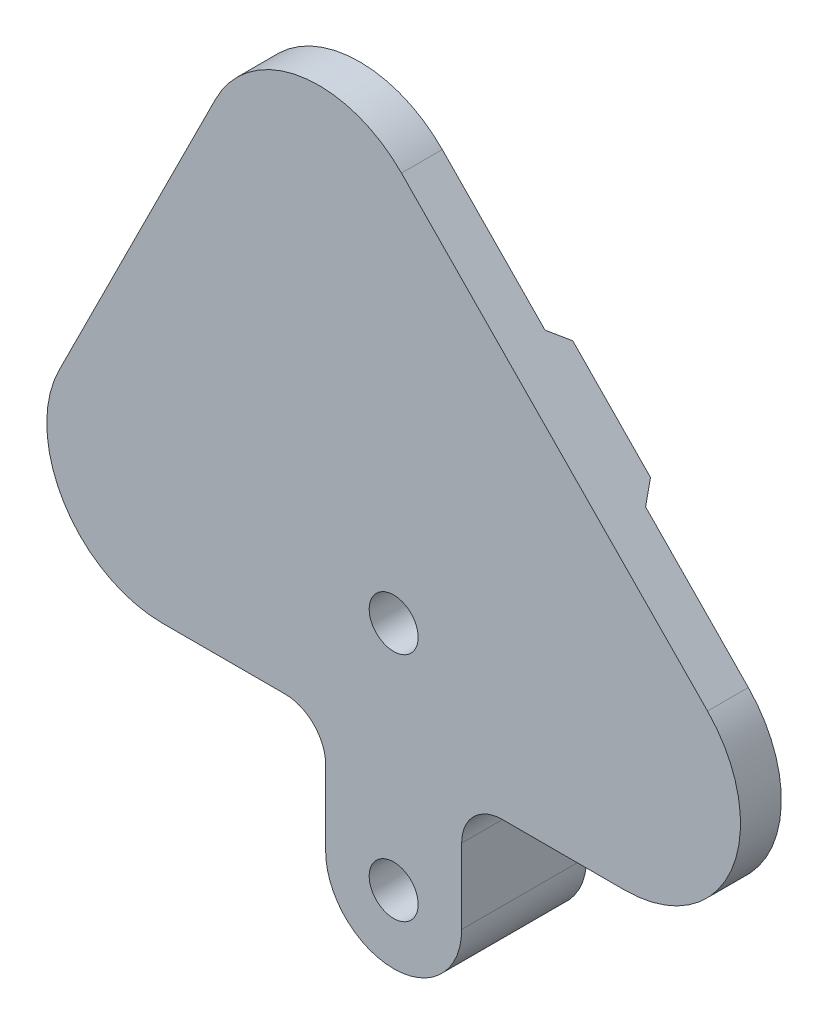
ISO-10303-21;
HEADER;
FILE_DESCRIPTION(('STEP AP214'),'2;1');
FILE_NAME('part.step','',(''),(''),'','','');
FILE_SCHEMA(('AUTOMOTIVE_DESIGN { 1 0 10303 214 1 1 1 1 }'));
ENDSEC;
DATA;
#1=APPLICATION_CONTEXT('core data for automotive mechanical design processes');
#2=APPLICATION_PROTOCOL_DEFINITION('international standard','automotive_design',2000,#1);
#3=PRODUCT_CONTEXT('',#1,'mechanical');
#4=PRODUCT('Part','Part','',(#3));
#5=PRODUCT_RELATED_PRODUCT_CATEGORY('part','',(#4));
#6=PRODUCT_DEFINITION_FORMATION('','',#4);
#7=PRODUCT_DEFINITION_CONTEXT('part definition',#1,'design');
#8=PRODUCT_DEFINITION('design','',#6,#7);
#9=PRODUCT_DEFINITION_SHAPE('','',#8);
#10=(LENGTH_UNIT() NAMED_UNIT(*) SI_UNIT(.MILLI.,.METRE.));
#11=(NAMED_UNIT(*) PLANE_ANGLE_UNIT() SI_UNIT($,.RADIAN.));
#12=(NAMED_UNIT(*) SI_UNIT($,.STERADIAN.) SOLID_ANGLE_UNIT());
#13=UNCERTAINTY_MEASURE_WITH_UNIT(LENGTH_MEASURE(1.E-05),#10,'distance_accuracy_value','');
#14=(GEOMETRIC_REPRESENTATION_CONTEXT(3) GLOBAL_UNCERTAINTY_ASSIGNED_CONTEXT((#13)) GLOBAL_UNIT_ASSIGNED_CONTEXT((#10,
#11,#12)) REPRESENTATION_CONTEXT('',''));
#15=CARTESIAN_POINT('',(0.,0.,0.));
#16=DIRECTION('',(0.,0.,1.));
#17=DIRECTION('',(1.,0.,0.));
#18=AXIS2_PLACEMENT_3D('',#15,#16,#17);
#19=CARTESIAN_POINT('',(9.00000000000001,-11.5,0.));
#20=DIRECTION('',(0.,0.,1.));
#21=DIRECTION('',(1.,0.,0.));
#22=AXIS2_PLACEMENT_3D('',#19,#20,#21);
#23=PLANE('',#22);
#24=CARTESIAN_POINT('',(34.,0.,0.));
#25=DIRECTION('',(0.,0.,-1.));
#26=DIRECTION('',(-1.,0.,0.));
#27=AXIS2_PLACEMENT_3D('',#24,#25,#26);
#28=CIRCLE('',#27,6.);
#29=CARTESIAN_POINT('',(28.,0.,0.));
#30=VERTEX_POINT('',#29);
#31=EDGE_CURVE('E281',#30,#30,#28,.T.);
#32=ORIENTED_EDGE('',*,*,#31,.F.);
#33=EDGE_LOOP('',(#32));
#34=FACE_BOUND('',#33,.T.);
#35=CARTESIAN_POINT('',(25.,3.78598738163178,0.));
#36=DIRECTION('',(0.,0.,1.));
#37=DIRECTION('',(1.,0.,0.));
#38=AXIS2_PLACEMENT_3D('',#35,#36,#37);
#39=CIRCLE('',#38,1.80000000000002);
#40=CARTESIAN_POINT('',(23.2,3.78598738163178,0.));
#41=VERTEX_POINT('',#40);
#42=CARTESIAN_POINT('',(23.7412705201653,5.07268862768507,0.));
#43=VERTEX_POINT('',#42);
#44=EDGE_CURVE('E401',#41,#43,#39,.F.);
#45=ORIENTED_EDGE('',*,*,#44,.T.);
#46=DIRECTION('',(0.714834025585147,0.699294155463731,0.));
#47=VECTOR('',#46,1.);
#48=CARTESIAN_POINT('',(32.5237123384654,13.6642077977613,0.));
#49=LINE('',#48,#47);
#50=CARTESIAN_POINT('',(32.5237123384654,13.6642077977613,0.));
#51=VERTEX_POINT('',#50);
#52=EDGE_CURVE('E403',#43,#51,#49,.T.);
#53=ORIENTED_EDGE('',*,*,#52,.T.);
#54=DIRECTION('',(-0.699294155463731,0.714834025585147,0.));
#55=VECTOR('',#54,1.);
#56=CARTESIAN_POINT('',(17.5760892174738,28.9440003214417,0.));
#57=LINE('',#56,#55);
#58=CARTESIAN_POINT('',(40.0760892174738,5.94400032144171,0.));
#59=VERTEX_POINT('',#58);
#60=EDGE_CURVE('E331',#59,#51,#57,.T.);
#61=ORIENTED_EDGE('',*,*,#60,.F.);
#62=CARTESIAN_POINT('',(34.,0.,0.));
#63=DIRECTION('',(0.,0.,1.));
#64=DIRECTION('',(1.,0.,0.));
#65=AXIS2_PLACEMENT_3D('',#62,#63,#64);
#66=CIRCLE('',#65,8.5);
#67=CARTESIAN_POINT('',(34.,-8.5,0.));
#68=VERTEX_POINT('',#67);
#69=EDGE_CURVE('E328',#68,#59,#66,.T.);
#70=ORIENTED_EDGE('',*,*,#69,.F.);
#71=DIRECTION('',(1.,0.,0.));
#72=VECTOR('',#71,1.);
#73=CARTESIAN_POINT('',(34.,-8.5,0.));
#74=LINE('',#73,#72);
#75=CARTESIAN_POINT('',(25.,-8.5,0.));
#76=VERTEX_POINT('',#75);
#77=EDGE_CURVE('E326',#76,#68,#74,.T.);
#78=ORIENTED_EDGE('',*,*,#77,.F.);
#79=CARTESIAN_POINT('',(25.,-11.5,0.));
#80=DIRECTION('',(0.,0.,-1.));
#81=DIRECTION('',(-1.,0.,0.));
#82=AXIS2_PLACEMENT_3D('',#79,#80,#81);
#83=CIRCLE('',#82,3.);
#84=CARTESIAN_POINT('',(23.2,-9.10000000000001,0.));
#85=VERTEX_POINT('',#84);
#86=EDGE_CURVE('E324',#85,#76,#83,.T.);
#87=ORIENTED_EDGE('',*,*,#86,.F.);
#88=DIRECTION('',(0.,1.,0.));
#89=VECTOR('',#88,1.);
#90=CARTESIAN_POINT('',(23.2,3.78598738163177,0.));
#91=LINE('',#90,#89);
#92=EDGE_CURVE('E399',#85,#41,#91,.T.);
#93=ORIENTED_EDGE('',*,*,#92,.T.);
#94=EDGE_LOOP('',(#45,#53,#61,#70,#78,#87,#93));
#95=FACE_BOUND('',#94,.T.);
#96=ADVANCED_FACE('F37',(#34,#95),#23,.F.);
#97=CARTESIAN_POINT('',(11.5,23.,0.));
#98=DIRECTION('',(0.,0.,-1.));
#99=DIRECTION('',(-1.,0.,0.));
#100=AXIS2_PLACEMENT_3D('',#97,#98,#99);
#101=CIRCLE('',#100,6.);
#102=CARTESIAN_POINT('',(5.5,23.,0.));
#103=VERTEX_POINT('',#102);
#104=EDGE_CURVE('E285',#103,#103,#101,.T.);
#105=ORIENTED_EDGE('',*,*,#104,.F.);
#106=EDGE_LOOP('',(#105));
#107=FACE_BOUND('',#106,.T.);
#108=CARTESIAN_POINT('',(13.9664545837515,12.8225007981251,0.));
#109=DIRECTION('',(0.,0.,1.));
#110=DIRECTION('',(1.,0.,0.));
#111=AXIS2_PLACEMENT_3D('',#108,#109,#110);
#112=CIRCLE('',#111,1.8);
#113=CARTESIAN_POINT('',(15.2251840635862,11.5357995520718,0.));
#114=VERTEX_POINT('',#113);
#115=CARTESIAN_POINT('',(13.1614701118516,11.2125318543253,0.));
#116=VERTEX_POINT('',#115);
#117=EDGE_CURVE('E389',#114,#116,#112,.F.);
#118=ORIENTED_EDGE('',*,*,#117,.T.);
#119=DIRECTION('',(-0.894427190999916,0.447213595499958,0.));
#120=VECTOR('',#119,1.);
#121=CARTESIAN_POINT('',(-0.485324359398882,18.0359290899505,0.));
#122=LINE('',#121,#120);
#123=CARTESIAN_POINT('',(-0.485324359398881,18.0359290899505,0.));
#124=VERTEX_POINT('',#123);
#125=EDGE_CURVE('E391',#116,#124,#122,.T.);
#126=ORIENTED_EDGE('',*,*,#125,.T.);
#127=DIRECTION('',(-0.447213595499958,-0.894427190999916,0.));
#128=VECTOR('',#127,1.);
#129=CARTESIAN_POINT('',(-7.60263112349929,3.80131556174964,0.));
#130=LINE('',#129,#128);
#131=CARTESIAN_POINT('',(3.89736887650071,26.8013155617496,0.));
#132=VERTEX_POINT('',#131);
#133=EDGE_CURVE('E337',#132,#124,#130,.T.);
#134=ORIENTED_EDGE('',*,*,#133,.F.);
#135=CARTESIAN_POINT('',(11.5,23.,0.));
#136=DIRECTION('',(0.,0.,1.));
#137=DIRECTION('',(1.,0.,0.));
#138=AXIS2_PLACEMENT_3D('',#135,#136,#137);
#139=CIRCLE('',#138,8.5);
#140=CARTESIAN_POINT('',(17.5760892174738,28.9440003214417,0.));
#141=VERTEX_POINT('',#140);
#142=EDGE_CURVE('E334',#141,#132,#139,.T.);
#143=ORIENTED_EDGE('',*,*,#142,.F.);
#144=CARTESIAN_POINT('',(25.128466096482,21.2237928451221,0.));
#145=VERTEX_POINT('',#144);
#146=EDGE_CURVE('E330',#145,#141,#57,.T.);
#147=ORIENTED_EDGE('',*,*,#146,.F.);
#148=DIRECTION('',(-0.714834025585147,-0.699294155463731,0.));
#149=VECTOR('',#148,1.);
#150=CARTESIAN_POINT('',(15.2251840635862,11.5357995520718,0.));
#151=LINE('',#150,#149);
#152=EDGE_CURVE('E387',#145,#114,#151,.T.);
#153=ORIENTED_EDGE('',*,*,#152,.T.);
#154=EDGE_LOOP('',(#118,#126,#134,#143,#147,#153));
#155=FACE_BOUND('',#154,.T.);
#156=ADVANCED_FACE('F477',(#107,#155),#23,.F.);
#157=CARTESIAN_POINT('',(0.,0.,0.));
#158=DIRECTION('',(0.,0.,-1.));
#159=DIRECTION('',(-1.,0.,0.));
#160=AXIS2_PLACEMENT_3D('',#157,#158,#159);
#161=CIRCLE('',#160,6.);
#162=CARTESIAN_POINT('',(-6.,0.,0.));
#163=VERTEX_POINT('',#162);
#164=EDGE_CURVE('E280',#163,#163,#161,.T.);
#165=ORIENTED_EDGE('',*,*,#164,.F.);
#166=EDGE_LOOP('',(#165));
#167=FACE_BOUND('',#166,.T.);
#168=CARTESIAN_POINT('',(-3.2199378875997,12.5667020335488,0.));
#169=VERTEX_POINT('',#168);
#170=CARTESIAN_POINT('',(-7.60263112349929,3.80131556174964,0.));
#171=VERTEX_POINT('',#170);
#172=EDGE_CURVE('E336',#169,#171,#130,.T.);
#173=ORIENTED_EDGE('',*,*,#172,.F.);
#174=DIRECTION('',(0.894427190999916,-0.447213595499958,0.));
#175=VECTOR('',#174,1.);
#176=CARTESIAN_POINT('',(9.80498447189993,6.05424085379901,0.));
#177=LINE('',#176,#175);
#178=CARTESIAN_POINT('',(9.80498447189993,6.05424085379901,0.));
#179=VERTEX_POINT('',#178);
#180=EDGE_CURVE('E397',#169,#179,#177,.T.);
#181=ORIENTED_EDGE('',*,*,#180,.T.);
#182=CARTESIAN_POINT('',(9.,4.44427190999916,0.));
#183=DIRECTION('',(0.,0.,1.));
#184=DIRECTION('',(1.,0.,0.));
#185=AXIS2_PLACEMENT_3D('',#182,#183,#184);
#186=CIRCLE('',#185,1.80000000000001);
#187=CARTESIAN_POINT('',(10.8,4.44427190999916,0.));
#188=VERTEX_POINT('',#187);
#189=EDGE_CURVE('E395',#179,#188,#186,.F.);
#190=ORIENTED_EDGE('',*,*,#189,.T.);
#191=DIRECTION('',(0.,-1.,0.));
#192=VECTOR('',#191,1.);
#193=CARTESIAN_POINT('',(10.8,-11.5,0.));
#194=LINE('',#193,#192);
#195=CARTESIAN_POINT('',(10.8,-9.10000000000001,0.));
#196=VERTEX_POINT('',#195);
#197=EDGE_CURVE('E393',#188,#196,#194,.T.);
#198=ORIENTED_EDGE('',*,*,#197,.T.);
#199=CARTESIAN_POINT('',(9.00000000000001,-11.5,0.));
#200=DIRECTION('',(0.,0.,-1.));
#201=DIRECTION('',(1.,0.,0.));
#202=AXIS2_PLACEMENT_3D('',#199,#200,#201);
#203=CIRCLE('',#202,3.);
#204=CARTESIAN_POINT('',(8.99999999999998,-8.5,0.));
#205=VERTEX_POINT('',#204);
#206=EDGE_CURVE('E295',#205,#196,#203,.T.);
#207=ORIENTED_EDGE('',*,*,#206,.F.);
#208=DIRECTION('',(1.,0.,0.));
#209=VECTOR('',#208,1.);
#210=CARTESIAN_POINT('',(8.99999999999998,-8.5,0.));
#211=LINE('',#210,#209);
#212=CARTESIAN_POINT('',(0.,-8.5,0.));
#213=VERTEX_POINT('',#212);
#214=EDGE_CURVE('E300',#213,#205,#211,.T.);
#215=ORIENTED_EDGE('',*,*,#214,.F.);
#216=CARTESIAN_POINT('',(0.,0.,0.));
#217=DIRECTION('',(0.,0.,1.));
#218=DIRECTION('',(1.,0.,0.));
#219=AXIS2_PLACEMENT_3D('',#216,#217,#218);
#220=CIRCLE('',#219,8.5);
#221=EDGE_CURVE('E340',#171,#213,#220,.T.);
#222=ORIENTED_EDGE('',*,*,#221,.F.);
#223=EDGE_LOOP('',(#173,#181,#190,#198,#207,#215,#222));
#224=FACE_BOUND('',#223,.T.);
#225=ADVANCED_FACE('F480',(#167,#224),#23,.F.);
#226=CARTESIAN_POINT('',(9.00000000000001,-11.5,3.));
#227=DIRECTION('',(0.,0.,1.));
#228=DIRECTION('',(1.,0.,0.));
#229=AXIS2_PLACEMENT_3D('',#226,#227,#228);
#230=PLANE('',#229);
#231=CARTESIAN_POINT('',(17.,0.,3.));
#232=DIRECTION('',(0.,0.,1.));
#233=DIRECTION('',(1.,0.,0.));
#234=AXIS2_PLACEMENT_3D('',#231,#232,#233);
#235=CIRCLE('',#234,1.8);
#236=CARTESIAN_POINT('',(18.8,0.,3.));
#237=VERTEX_POINT('',#236);
#238=EDGE_CURVE('E292',#237,#237,#235,.T.);
#239=ORIENTED_EDGE('',*,*,#238,.F.);
#240=EDGE_LOOP('',(#239));
#241=FACE_BOUND('',#240,.T.);
#242=CARTESIAN_POINT('',(9.00000000000001,-11.5,3.));
#243=DIRECTION('',(0.,0.,-1.));
#244=DIRECTION('',(1.,0.,0.));
#245=AXIS2_PLACEMENT_3D('',#242,#243,#244);
#246=CIRCLE('',#245,3.);
#247=CARTESIAN_POINT('',(8.99999999999998,-8.5,3.));
#248=VERTEX_POINT('',#247);
#249=CARTESIAN_POINT('',(12.,-11.5,3.));
#250=VERTEX_POINT('',#249);
#251=EDGE_CURVE('E296',#248,#250,#246,.T.);
#252=ORIENTED_EDGE('',*,*,#251,.T.);
#253=DIRECTION('',(0.,-1.,0.));
#254=VECTOR('',#253,1.);
#255=CARTESIAN_POINT('',(12.,-17.,3.));
#256=LINE('',#255,#254);
#257=CARTESIAN_POINT('',(12.,-17.,3.));
#258=VERTEX_POINT('',#257);
#259=EDGE_CURVE('E299',#250,#258,#256,.T.);
#260=ORIENTED_EDGE('',*,*,#259,.T.);
#261=CARTESIAN_POINT('',(17.,-17.,3.));
#262=DIRECTION('',(0.,0.,1.));
#263=DIRECTION('',(1.,0.,0.));
#264=AXIS2_PLACEMENT_3D('',#261,#262,#263);
#265=CIRCLE('',#264,5.);
#266=CARTESIAN_POINT('',(22.,-17.,3.));
#267=VERTEX_POINT('',#266);
#268=EDGE_CURVE('E214',#258,#267,#265,.T.);
#269=ORIENTED_EDGE('',*,*,#268,.T.);
#270=DIRECTION('',(0.,1.,0.));
#271=VECTOR('',#270,1.);
#272=CARTESIAN_POINT('',(22.,-17.,3.));
#273=LINE('',#272,#271);
#274=CARTESIAN_POINT('',(22.,-11.5,3.));
#275=VERTEX_POINT('',#274);
#276=EDGE_CURVE('E303',#267,#275,#273,.T.);
#277=ORIENTED_EDGE('',*,*,#276,.T.);
#278=CARTESIAN_POINT('',(25.,-11.5,3.));
#279=DIRECTION('',(0.,0.,-1.));
#280=DIRECTION('',(-1.,0.,0.));
#281=AXIS2_PLACEMENT_3D('',#278,#279,#280);
#282=CIRCLE('',#281,3.);
#283=CARTESIAN_POINT('',(25.,-8.5,3.));
#284=VERTEX_POINT('',#283);
#285=EDGE_CURVE('E305',#275,#284,#282,.T.);
#286=ORIENTED_EDGE('',*,*,#285,.T.);
#287=DIRECTION('',(1.,0.,0.));
#288=VECTOR('',#287,1.);
#289=CARTESIAN_POINT('',(34.,-8.5,3.));
#290=LINE('',#289,#288);
#291=CARTESIAN_POINT('',(34.,-8.5,3.));
#292=VERTEX_POINT('',#291);
#293=EDGE_CURVE('E307',#284,#292,#290,.T.);
#294=ORIENTED_EDGE('',*,*,#293,.T.);
#295=CARTESIAN_POINT('',(34.,0.,3.));
#296=DIRECTION('',(0.,0.,1.));
#297=DIRECTION('',(1.,0.,0.));
#298=AXIS2_PLACEMENT_3D('',#295,#296,#297);
#299=CIRCLE('',#298,8.5);
#300=CARTESIAN_POINT('',(40.0760892174738,5.94400032144171,3.));
#301=VERTEX_POINT('',#300);
#302=EDGE_CURVE('E309',#292,#301,#299,.T.);
#303=ORIENTED_EDGE('',*,*,#302,.T.);
#304=DIRECTION('',(-0.699294155463731,0.714834025585147,0.));
#305=VECTOR('',#304,1.);
#306=CARTESIAN_POINT('',(17.5760892174738,28.9440003214417,3.));
#307=LINE('',#306,#305);
#308=CARTESIAN_POINT('',(17.5760892174738,28.9440003214417,3.));
#309=VERTEX_POINT('',#308);
#310=EDGE_CURVE('E311',#301,#309,#307,.T.);
#311=ORIENTED_EDGE('',*,*,#310,.T.);
#312=CARTESIAN_POINT('',(11.5,23.,3.));
#313=DIRECTION('',(0.,0.,1.));
#314=DIRECTION('',(1.,0.,0.));
#315=AXIS2_PLACEMENT_3D('',#312,#313,#314);
#316=CIRCLE('',#315,8.5);
#317=CARTESIAN_POINT('',(3.89736887650071,26.8013155617496,3.));
#318=VERTEX_POINT('',#317);
#319=EDGE_CURVE('E313',#309,#318,#316,.T.);
#320=ORIENTED_EDGE('',*,*,#319,.T.);
#321=DIRECTION('',(-0.447213595499958,-0.894427190999916,0.));
#322=VECTOR('',#321,1.);
#323=CARTESIAN_POINT('',(-7.60263112349929,3.80131556174964,3.));
#324=LINE('',#323,#322);
#325=CARTESIAN_POINT('',(-7.60263112349929,3.80131556174964,3.));
#326=VERTEX_POINT('',#325);
#327=EDGE_CURVE('E315',#318,#326,#324,.T.);
#328=ORIENTED_EDGE('',*,*,#327,.T.);
#329=CARTESIAN_POINT('',(0.,0.,3.));
#330=DIRECTION('',(0.,0.,1.));
#331=DIRECTION('',(1.,0.,0.));
#332=AXIS2_PLACEMENT_3D('',#329,#330,#331);
#333=CIRCLE('',#332,8.5);
#334=CARTESIAN_POINT('',(0.,-8.5,3.));
#335=VERTEX_POINT('',#334);
#336=EDGE_CURVE('E317',#326,#335,#333,.T.);
#337=ORIENTED_EDGE('',*,*,#336,.T.);
#338=DIRECTION('',(1.,0.,0.));
#339=VECTOR('',#338,1.);
#340=CARTESIAN_POINT('',(8.99999999999998,-8.5,3.));
#341=LINE('',#340,#339);
#342=EDGE_CURVE('E319',#335,#248,#341,.T.);
#343=ORIENTED_EDGE('',*,*,#342,.T.);
#344=EDGE_LOOP('',(#252,#260,#269,#277,#286,#294,#303,#311,#320,#328,#337,#343));
#345=FACE_BOUND('',#344,.T.);
#346=CARTESIAN_POINT('',(17.,-17.,3.));
#347=DIRECTION('',(0.,0.,1.));
#348=DIRECTION('',(1.,0.,0.));
#349=AXIS2_PLACEMENT_3D('',#346,#347,#348);
#350=CIRCLE('',#349,1.8);
#351=CARTESIAN_POINT('',(18.8,-17.,3.));
#352=VERTEX_POINT('',#351);
#353=EDGE_CURVE('E284',#352,#352,#350,.T.);
#354=ORIENTED_EDGE('',*,*,#353,.F.);
#355=EDGE_LOOP('',(#354));
#356=FACE_BOUND('',#355,.T.);
#357=ADVANCED_FACE('F461',(#241,#345,#356),#230,.T.);
#358=CARTESIAN_POINT('',(9.00000000000001,-11.5,3.));
#359=DIRECTION('',(0.,0.,-1.));
#360=DIRECTION('',(-1.,0.,0.));
#361=AXIS2_PLACEMENT_3D('',#358,#359,#360);
#362=CYLINDRICAL_SURFACE('',#361,3.);
#363=ORIENTED_EDGE('',*,*,#206,.T.);
#364=CARTESIAN_POINT('',(9.00000000000001,-11.5,1.80000000000003));
#365=DIRECTION('',(-0.707106781186552,0.,-0.707106781186543));
#366=DIRECTION('',(0.707106781186543,0.,-0.707106781186552));
#367=AXIS2_PLACEMENT_3D('',#364,#365,#366);
#368=ELLIPSE('',#367,4.24264068711931,3.);
#369=CARTESIAN_POINT('',(12.,-11.5,-1.2));
#370=VERTEX_POINT('',#369);
#371=EDGE_CURVE('E411',#196,#370,#368,.T.);
#372=ORIENTED_EDGE('',*,*,#371,.T.);
#373=DIRECTION('',(0.,0.,-1.));
#374=VECTOR('',#373,1.);
#375=CARTESIAN_POINT('',(12.,-11.5,3.));
#376=LINE('',#375,#374);
#377=EDGE_CURVE('E216',#250,#370,#376,.T.);
#378=ORIENTED_EDGE('',*,*,#377,.F.);
#379=ORIENTED_EDGE('',*,*,#251,.F.);
#380=DIRECTION('',(0.,0.,-1.));
#381=VECTOR('',#380,1.);
#382=CARTESIAN_POINT('',(8.99999999999998,-8.5,3.));
#383=LINE('',#382,#381);
#384=EDGE_CURVE('E321',#248,#205,#383,.T.);
#385=ORIENTED_EDGE('',*,*,#384,.T.);
#386=EDGE_LOOP('',(#363,#372,#378,#379,#385));
#387=FACE_BOUND('',#386,.T.);
#388=ADVANCED_FACE('F495',(#387),#362,.F.);
#389=CARTESIAN_POINT('',(12.,-17.,3.));
#390=DIRECTION('',(1.,0.,0.));
#391=DIRECTION('',(0.,1.,0.));
#392=AXIS2_PLACEMENT_3D('',#389,#390,#391);
#393=PLANE('',#392);
#394=ORIENTED_EDGE('',*,*,#377,.T.);
#395=DIRECTION('',(0.,1.,0.));
#396=VECTOR('',#395,1.);
#397=CARTESIAN_POINT('',(12.,-17.,-1.2));
#398=LINE('',#397,#396);
#399=CARTESIAN_POINT('',(12.,-12.1,-1.2));
#400=VERTEX_POINT('',#399);
#401=EDGE_CURVE('E251',#400,#370,#398,.T.);
#402=ORIENTED_EDGE('',*,*,#401,.F.);
#403=DIRECTION('',(0.,0.,1.));
#404=VECTOR('',#403,1.);
#405=CARTESIAN_POINT('',(12.,-12.1,-6.2));
#406=LINE('',#405,#404);
#407=CARTESIAN_POINT('',(12.,-12.1,-6.2));
#408=VERTEX_POINT('',#407);
#409=EDGE_CURVE('E224',#408,#400,#406,.T.);
#410=ORIENTED_EDGE('',*,*,#409,.F.);
#411=DIRECTION('',(0.,1.,0.));
#412=VECTOR('',#411,1.);
#413=CARTESIAN_POINT('',(12.,-12.1,-6.2));
#414=LINE('',#413,#412);
#415=CARTESIAN_POINT('',(12.,-17.,-6.2));
#416=VERTEX_POINT('',#415);
#417=EDGE_CURVE('E220',#416,#408,#414,.T.);
#418=ORIENTED_EDGE('',*,*,#417,.F.);
#419=DIRECTION('',(0.,0.,-1.));
#420=VECTOR('',#419,1.);
#421=CARTESIAN_POINT('',(12.,-17.,3.));
#422=LINE('',#421,#420);
#423=EDGE_CURVE('E208',#258,#416,#422,.T.);
#424=ORIENTED_EDGE('',*,*,#423,.F.);
#425=ORIENTED_EDGE('',*,*,#259,.F.);
#426=EDGE_LOOP('',(#394,#402,#410,#418,#424,#425));
#427=FACE_BOUND('',#426,.T.);
#428=ADVANCED_FACE('F222',(#427),#393,.F.);
#429=CARTESIAN_POINT('',(17.,-17.,3.));
#430=DIRECTION('',(0.,0.,-1.));
#431=DIRECTION('',(-1.,0.,0.));
#432=AXIS2_PLACEMENT_3D('',#429,#430,#431);
#433=CYLINDRICAL_SURFACE('',#432,5.);
#434=ORIENTED_EDGE('',*,*,#423,.T.);
#435=CARTESIAN_POINT('',(17.,-17.,-6.2));
#436=DIRECTION('',(0.,0.,-1.));
#437=DIRECTION('',(-1.,0.,0.));
#438=AXIS2_PLACEMENT_3D('',#435,#436,#437);
#439=CIRCLE('',#438,5.);
#440=CARTESIAN_POINT('',(22.,-17.,-6.2));
#441=VERTEX_POINT('',#440);
#442=EDGE_CURVE('E213',#441,#416,#439,.T.);
#443=ORIENTED_EDGE('',*,*,#442,.F.);
#444=DIRECTION('',(0.,0.,-1.));
#445=VECTOR('',#444,1.);
#446=CARTESIAN_POINT('',(22.,-17.,3.));
#447=LINE('',#446,#445);
#448=EDGE_CURVE('E217',#267,#441,#447,.T.);
#449=ORIENTED_EDGE('',*,*,#448,.F.);
#450=ORIENTED_EDGE('',*,*,#268,.F.);
#451=EDGE_LOOP('',(#434,#443,#449,#450));
#452=FACE_BOUND('',#451,.T.);
#453=ADVANCED_FACE('F210',(#452),#433,.T.);
#454=CARTESIAN_POINT('',(22.,-17.,3.));
#455=DIRECTION('',(-1.,0.,0.));
#456=DIRECTION('',(0.,-1.,0.));
#457=AXIS2_PLACEMENT_3D('',#454,#455,#456);
#458=PLANE('',#457);
#459=DIRECTION('',(0.,-1.,0.));
#460=VECTOR('',#459,1.);
#461=CARTESIAN_POINT('',(22.,-17.,-1.2));
#462=LINE('',#461,#460);
#463=CARTESIAN_POINT('',(22.,-11.5,-1.2));
#464=VERTEX_POINT('',#463);
#465=CARTESIAN_POINT('',(22.,-12.1,-1.2));
#466=VERTEX_POINT('',#465);
#467=EDGE_CURVE('E276',#464,#466,#462,.T.);
#468=ORIENTED_EDGE('',*,*,#467,.F.);
#469=DIRECTION('',(0.,0.,-1.));
#470=VECTOR('',#469,1.);
#471=CARTESIAN_POINT('',(22.,-11.5,3.));
#472=LINE('',#471,#470);
#473=EDGE_CURVE('E62',#275,#464,#472,.T.);
#474=ORIENTED_EDGE('',*,*,#473,.F.);
#475=ORIENTED_EDGE('',*,*,#276,.F.);
#476=ORIENTED_EDGE('',*,*,#448,.T.);
#477=DIRECTION('',(0.,-1.,0.));
#478=VECTOR('',#477,1.);
#479=CARTESIAN_POINT('',(22.,-12.1,-6.2));
#480=LINE('',#479,#478);
#481=CARTESIAN_POINT('',(22.,-12.1,-6.2));
#482=VERTEX_POINT('',#481);
#483=EDGE_CURVE('E233',#482,#441,#480,.T.);
#484=ORIENTED_EDGE('',*,*,#483,.F.);
#485=DIRECTION('',(0.,0.,1.));
#486=VECTOR('',#485,1.);
#487=CARTESIAN_POINT('',(22.,-12.1,-6.2));
#488=LINE('',#487,#486);
#489=EDGE_CURVE('E240',#482,#466,#488,.T.);
#490=ORIENTED_EDGE('',*,*,#489,.T.);
#491=EDGE_LOOP('',(#468,#474,#475,#476,#484,#490));
#492=FACE_BOUND('',#491,.T.);
#493=ADVANCED_FACE('F465',(#492),#458,.F.);
#494=CARTESIAN_POINT('',(25.,-11.5,3.));
#495=DIRECTION('',(0.,0.,-1.));
#496=DIRECTION('',(-1.,0.,0.));
#497=AXIS2_PLACEMENT_3D('',#494,#495,#496);
#498=CYLINDRICAL_SURFACE('',#497,3.);
#499=ORIENTED_EDGE('',*,*,#473,.T.);
#500=CARTESIAN_POINT('',(25.,-11.5,1.80000000000004));
#501=DIRECTION('',(0.707106781186552,0.,-0.707106781186543));
#502=DIRECTION('',(-0.707106781186543,0.,-0.707106781186552));
#503=AXIS2_PLACEMENT_3D('',#500,#501,#502);
#504=ELLIPSE('',#503,4.24264068711931,3.);
#505=EDGE_CURVE('E11',#464,#85,#504,.T.);
#506=ORIENTED_EDGE('',*,*,#505,.T.);
#507=ORIENTED_EDGE('',*,*,#86,.T.);
#508=DIRECTION('',(0.,0.,-1.));
#509=VECTOR('',#508,1.);
#510=CARTESIAN_POINT('',(25.,-8.5,3.));
#511=LINE('',#510,#509);
#512=EDGE_CURVE('E363',#284,#76,#511,.T.);
#513=ORIENTED_EDGE('',*,*,#512,.F.);
#514=ORIENTED_EDGE('',*,*,#285,.F.);
#515=EDGE_LOOP('',(#499,#506,#507,#513,#514));
#516=FACE_BOUND('',#515,.T.);
#517=ADVANCED_FACE('F454',(#516),#498,.F.);
#518=CARTESIAN_POINT('',(34.,-8.5,3.));
#519=DIRECTION('',(0.,1.,0.));
#520=DIRECTION('',(-1.,0.,0.));
#521=AXIS2_PLACEMENT_3D('',#518,#519,#520);
#522=PLANE('',#521);
#523=ORIENTED_EDGE('',*,*,#77,.T.);
#524=DIRECTION('',(0.,0.,-1.));
#525=VECTOR('',#524,1.);
#526=CARTESIAN_POINT('',(34.,-8.5,3.));
#527=LINE('',#526,#525);
#528=EDGE_CURVE('E360',#292,#68,#527,.T.);
#529=ORIENTED_EDGE('',*,*,#528,.F.);
#530=ORIENTED_EDGE('',*,*,#293,.F.);
#531=ORIENTED_EDGE('',*,*,#512,.T.);
#532=EDGE_LOOP('',(#523,#529,#530,#531));
#533=FACE_BOUND('',#532,.T.);
#534=ADVANCED_FACE('F457',(#533),#522,.F.);
#535=CARTESIAN_POINT('',(34.,0.,3.));
#536=DIRECTION('',(0.,0.,-1.));
#537=DIRECTION('',(-1.,0.,0.));
#538=AXIS2_PLACEMENT_3D('',#535,#536,#537);
#539=CYLINDRICAL_SURFACE('',#538,8.5);
#540=ORIENTED_EDGE('',*,*,#69,.T.);
#541=DIRECTION('',(0.,0.,-1.));
#542=VECTOR('',#541,1.);
#543=CARTESIAN_POINT('',(40.0760892174738,5.94400032144171,3.));
#544=LINE('',#543,#542);
#545=EDGE_CURVE('E357',#301,#59,#544,.T.);
#546=ORIENTED_EDGE('',*,*,#545,.F.);
#547=ORIENTED_EDGE('',*,*,#302,.F.);
#548=ORIENTED_EDGE('',*,*,#528,.T.);
#549=EDGE_LOOP('',(#540,#546,#547,#548));
#550=FACE_BOUND('',#549,.T.);
#551=ADVANCED_FACE('F652',(#550),#539,.T.);
#552=CARTESIAN_POINT('',(17.5760892174738,28.9440003214417,3.));
#553=DIRECTION('',(-0.714834025585147,-0.699294155463731,0.));
#554=DIRECTION('',(0.699294155463731,-0.714834025585147,0.));
#555=AXIS2_PLACEMENT_3D('',#552,#553,#554);
#556=PLANE('',#555);
#557=ORIENTED_EDGE('',*,*,#60,.T.);
#558=DIRECTION('',(0.49447563937252,-0.505463986914132,0.707106781186553));
#559=VECTOR('',#558,1.);
#560=CARTESIAN_POINT('',(26.0988420111653,20.2318530212237,-9.18765054319614));
#561=LINE('',#560,#559);
#562=CARTESIAN_POINT('',(31.684559351909,14.5220086284635,-1.2));
#563=VERTEX_POINT('',#562);
#564=EDGE_CURVE('E47',#51,#563,#561,.F.);
#565=ORIENTED_EDGE('',*,*,#564,.T.);
#566=DIRECTION('',(0.699294155463731,-0.714834025585148,0.));
#567=VECTOR('',#566,1.);
#568=CARTESIAN_POINT('',(25.9676190830385,20.3659920144199,-1.2));
#569=LINE('',#568,#567);
#570=CARTESIAN_POINT('',(25.9676190830385,20.3659920144199,-1.2));
#571=VERTEX_POINT('',#570);
#572=EDGE_CURVE('E268',#571,#563,#569,.T.);
#573=ORIENTED_EDGE('',*,*,#572,.F.);
#574=DIRECTION('',(0.494475639372525,-0.505463986914137,-0.707106781186547));
#575=VECTOR('',#574,1.);
#576=CARTESIAN_POINT('',(20.3033364237823,26.1561476216597,6.9));
#577=LINE('',#576,#575);
#578=EDGE_CURVE('E407',#571,#145,#577,.F.);
#579=ORIENTED_EDGE('',*,*,#578,.T.);
#580=ORIENTED_EDGE('',*,*,#146,.T.);
#581=DIRECTION('',(0.,0.,-1.));
#582=VECTOR('',#581,1.);
#583=CARTESIAN_POINT('',(17.5760892174738,28.9440003214417,3.));
#584=LINE('',#583,#582);
#585=EDGE_CURVE('E354',#309,#141,#584,.T.);
#586=ORIENTED_EDGE('',*,*,#585,.F.);
#587=ORIENTED_EDGE('',*,*,#310,.F.);
#588=ORIENTED_EDGE('',*,*,#545,.T.);
#589=EDGE_LOOP('',(#557,#565,#573,#579,#580,#586,#587,#588));
#590=FACE_BOUND('',#589,.T.);
#591=ADVANCED_FACE('F444',(#590),#556,.F.);
#592=CARTESIAN_POINT('',(11.5,23.,3.));
#593=DIRECTION('',(0.,0.,-1.));
#594=DIRECTION('',(-1.,0.,0.));
#595=AXIS2_PLACEMENT_3D('',#592,#593,#594);
#596=CYLINDRICAL_SURFACE('',#595,8.5);
#597=ORIENTED_EDGE('',*,*,#142,.T.);
#598=DIRECTION('',(0.,0.,-1.));
#599=VECTOR('',#598,1.);
#600=CARTESIAN_POINT('',(3.89736887650071,26.8013155617496,3.));
#601=LINE('',#600,#599);
#602=EDGE_CURVE('E351',#318,#132,#601,.T.);
#603=ORIENTED_EDGE('',*,*,#602,.F.);
#604=ORIENTED_EDGE('',*,*,#319,.F.);
#605=ORIENTED_EDGE('',*,*,#585,.T.);
#606=EDGE_LOOP('',(#597,#603,#604,#605));
#607=FACE_BOUND('',#606,.T.);
#608=ADVANCED_FACE('F538',(#607),#596,.T.);
#609=CARTESIAN_POINT('',(-7.60263112349929,3.80131556174964,3.));
#610=DIRECTION('',(0.894427190999916,-0.447213595499958,0.));
#611=DIRECTION('',(0.447213595499958,0.894427190999916,0.));
#612=AXIS2_PLACEMENT_3D('',#609,#610,#611);
#613=PLANE('',#612);
#614=ORIENTED_EDGE('',*,*,#133,.T.);
#615=DIRECTION('',(0.316227766016838,0.632455532033676,0.707106781186548));
#616=VECTOR('',#615,1.);
#617=CARTESIAN_POINT('',(-3.37315734819914,12.2602631123499,-6.45739087062379));
#618=LINE('',#617,#616);
#619=CARTESIAN_POINT('',(-1.02198067399883,16.9626164607506,-1.2));
#620=VERTEX_POINT('',#619);
#621=EDGE_CURVE('E405',#124,#620,#618,.F.);
#622=ORIENTED_EDGE('',*,*,#621,.T.);
#623=DIRECTION('',(0.447213595499958,0.894427190999916,0.));
#624=VECTOR('',#623,1.);
#625=CARTESIAN_POINT('',(-1.02198067399883,16.9626164607506,-1.2));
#626=LINE('',#625,#624);
#627=CARTESIAN_POINT('',(-2.68328157299975,13.6400146627487,-1.2));
#628=VERTEX_POINT('',#627);
#629=EDGE_CURVE('E258',#628,#620,#626,.T.);
#630=ORIENTED_EDGE('',*,*,#629,.F.);
#631=DIRECTION('',(0.316227766016836,0.632455532033674,-0.70710678118655));
#632=VECTOR('',#631,1.);
#633=CARTESIAN_POINT('',(-6.08210489879941,6.84236801114939,6.40000000000001));
#634=LINE('',#633,#632);
#635=EDGE_CURVE('E409',#628,#169,#634,.F.);
#636=ORIENTED_EDGE('',*,*,#635,.T.);
#637=ORIENTED_EDGE('',*,*,#172,.T.);
#638=DIRECTION('',(0.,0.,-1.));
#639=VECTOR('',#638,1.);
#640=CARTESIAN_POINT('',(-7.60263112349929,3.80131556174964,3.));
#641=LINE('',#640,#639);
#642=EDGE_CURVE('E348',#326,#171,#641,.T.);
#643=ORIENTED_EDGE('',*,*,#642,.F.);
#644=ORIENTED_EDGE('',*,*,#327,.F.);
#645=ORIENTED_EDGE('',*,*,#602,.T.);
#646=EDGE_LOOP('',(#614,#622,#630,#636,#637,#643,#644,#645));
#647=FACE_BOUND('',#646,.T.);
#648=ADVANCED_FACE('F532',(#647),#613,.F.);
#649=CARTESIAN_POINT('',(0.,0.,3.));
#650=DIRECTION('',(0.,0.,-1.));
#651=DIRECTION('',(-1.,0.,0.));
#652=AXIS2_PLACEMENT_3D('',#649,#650,#651);
#653=CYLINDRICAL_SURFACE('',#652,8.5);
#654=ORIENTED_EDGE('',*,*,#221,.T.);
#655=DIRECTION('',(0.,0.,-1.));
#656=VECTOR('',#655,1.);
#657=CARTESIAN_POINT('',(0.,-8.5,3.));
#658=LINE('',#657,#656);
#659=EDGE_CURVE('E345',#335,#213,#658,.T.);
#660=ORIENTED_EDGE('',*,*,#659,.F.);
#661=ORIENTED_EDGE('',*,*,#336,.F.);
#662=ORIENTED_EDGE('',*,*,#642,.T.);
#663=EDGE_LOOP('',(#654,#660,#661,#662));
#664=FACE_BOUND('',#663,.T.);
#665=ADVANCED_FACE('F530',(#664),#653,.T.);
#666=CARTESIAN_POINT('',(8.99999999999998,-8.5,3.));
#667=DIRECTION('',(0.,1.,0.));
#668=DIRECTION('',(-1.,0.,0.));
#669=AXIS2_PLACEMENT_3D('',#666,#667,#668);
#670=PLANE('',#669);
#671=ORIENTED_EDGE('',*,*,#214,.T.);
#672=ORIENTED_EDGE('',*,*,#384,.F.);
#673=ORIENTED_EDGE('',*,*,#342,.F.);
#674=ORIENTED_EDGE('',*,*,#659,.T.);
#675=EDGE_LOOP('',(#671,#672,#673,#674));
#676=FACE_BOUND('',#675,.T.);
#677=ADVANCED_FACE('F525',(#676),#670,.F.);
#678=CARTESIAN_POINT('',(17.,0.,3.));
#679=DIRECTION('',(0.,0.,-1.));
#680=DIRECTION('',(-1.,0.,0.));
#681=AXIS2_PLACEMENT_3D('',#678,#679,#680);
#682=CYLINDRICAL_SURFACE('',#681,1.8);
#683=ORIENTED_EDGE('',*,*,#238,.T.);
#684=EDGE_LOOP('',(#683));
#685=FACE_BOUND('',#684,.T.);
#686=CARTESIAN_POINT('',(17.,0.,-1.2));
#687=DIRECTION('',(0.,0.,-1.));
#688=DIRECTION('',(-1.,0.,0.));
#689=AXIS2_PLACEMENT_3D('',#686,#687,#688);
#690=CIRCLE('',#689,1.8);
#691=CARTESIAN_POINT('',(15.2,0.,-1.2));
#692=VERTEX_POINT('',#691);
#693=EDGE_CURVE('E246',#692,#692,#690,.T.);
#694=ORIENTED_EDGE('',*,*,#693,.T.);
#695=EDGE_LOOP('',(#694));
#696=FACE_BOUND('',#695,.T.);
#697=ADVANCED_FACE('F717',(#685,#696),#682,.F.);
#698=CARTESIAN_POINT('',(17.,-17.,3.));
#699=DIRECTION('',(0.,0.,-1.));
#700=DIRECTION('',(-1.,0.,0.));
#701=AXIS2_PLACEMENT_3D('',#698,#699,#700);
#702=CYLINDRICAL_SURFACE('',#701,1.8);
#703=ORIENTED_EDGE('',*,*,#353,.T.);
#704=EDGE_LOOP('',(#703));
#705=FACE_BOUND('',#704,.T.);
#706=CARTESIAN_POINT('',(17.,-17.,-6.2));
#707=DIRECTION('',(0.,0.,-1.));
#708=DIRECTION('',(-1.,0.,0.));
#709=AXIS2_PLACEMENT_3D('',#706,#707,#708);
#710=CIRCLE('',#709,1.8);
#711=CARTESIAN_POINT('',(15.2,-17.,-6.2));
#712=VERTEX_POINT('',#711);
#713=EDGE_CURVE('E235',#712,#712,#710,.T.);
#714=ORIENTED_EDGE('',*,*,#713,.T.);
#715=EDGE_LOOP('',(#714));
#716=FACE_BOUND('',#715,.T.);
#717=ADVANCED_FACE('F729',(#705,#716),#702,.F.);
#718=CARTESIAN_POINT('',(0.,0.,2.));
#719=DIRECTION('',(0.,0.,-1.));
#720=DIRECTION('',(-1.,0.,0.));
#721=AXIS2_PLACEMENT_3D('',#718,#719,#720);
#722=CYLINDRICAL_SURFACE('',#721,6.);
#723=CARTESIAN_POINT('',(0.,0.,1.5));
#724=DIRECTION('',(0.,0.,-1.));
#725=DIRECTION('',(-1.,0.,0.));
#726=AXIS2_PLACEMENT_3D('',#723,#724,#725);
#727=CIRCLE('',#726,6.);
#728=CARTESIAN_POINT('',(-6.,0.,1.5));
#729=VERTEX_POINT('',#728);
#730=EDGE_CURVE('E378',#729,#729,#727,.F.);
#731=ORIENTED_EDGE('',*,*,#730,.T.);
#732=EDGE_LOOP('',(#731));
#733=FACE_BOUND('',#732,.T.);
#734=ORIENTED_EDGE('',*,*,#164,.T.);
#735=EDGE_LOOP('',(#734));
#736=FACE_BOUND('',#735,.T.);
#737=ADVANCED_FACE('F723',(#733,#736),#722,.F.);
#738=CARTESIAN_POINT('',(0.,0.,2.));
#739=DIRECTION('',(0.,0.,-1.));
#740=DIRECTION('',(-1.,0.,0.));
#741=AXIS2_PLACEMENT_3D('',#738,#739,#740);
#742=PLANE('',#741);
#743=CARTESIAN_POINT('',(0.,0.,2.));
#744=DIRECTION('',(0.,0.,-1.));
#745=DIRECTION('',(-1.,0.,0.));
#746=AXIS2_PLACEMENT_3D('',#743,#744,#745);
#747=CIRCLE('',#746,5.49999999999999);
#748=CARTESIAN_POINT('',(-5.49999999999999,0.,2.));
#749=VERTEX_POINT('',#748);
#750=EDGE_CURVE('E375',#749,#749,#747,.T.);
#751=ORIENTED_EDGE('',*,*,#750,.T.);
#752=EDGE_LOOP('',(#751));
#753=FACE_BOUND('',#752,.T.);
#754=ADVANCED_FACE('F728',(#753),#742,.T.);
#755=CARTESIAN_POINT('',(11.5,23.,2.));
#756=DIRECTION('',(0.,0.,-1.));
#757=DIRECTION('',(-1.,0.,0.));
#758=AXIS2_PLACEMENT_3D('',#755,#756,#757);
#759=CYLINDRICAL_SURFACE('',#758,6.);
#760=CARTESIAN_POINT('',(11.5,23.,1.5));
#761=DIRECTION('',(0.,0.,-1.));
#762=DIRECTION('',(-1.,0.,0.));
#763=AXIS2_PLACEMENT_3D('',#760,#761,#762);
#764=CIRCLE('',#763,6.);
#765=CARTESIAN_POINT('',(5.5,23.,1.5));
#766=VERTEX_POINT('',#765);
#767=EDGE_CURVE('E372',#766,#766,#764,.F.);
#768=ORIENTED_EDGE('',*,*,#767,.T.);
#769=EDGE_LOOP('',(#768));
#770=FACE_BOUND('',#769,.T.);
#771=ORIENTED_EDGE('',*,*,#104,.T.);
#772=EDGE_LOOP('',(#771));
#773=FACE_BOUND('',#772,.T.);
#774=ADVANCED_FACE('F741',(#770,#773),#759,.F.);
#775=CARTESIAN_POINT('',(11.5,23.,2.));
#776=DIRECTION('',(0.,0.,-1.));
#777=DIRECTION('',(-1.,0.,0.));
#778=AXIS2_PLACEMENT_3D('',#775,#776,#777);
#779=PLANE('',#778);
#780=CARTESIAN_POINT('',(11.5,23.,2.));
#781=DIRECTION('',(0.,0.,-1.));
#782=DIRECTION('',(-1.,0.,0.));
#783=AXIS2_PLACEMENT_3D('',#780,#781,#782);
#784=CIRCLE('',#783,5.49999999999999);
#785=CARTESIAN_POINT('',(6.00000000000001,23.,2.));
#786=VERTEX_POINT('',#785);
#787=EDGE_CURVE('E369',#786,#786,#784,.T.);
#788=ORIENTED_EDGE('',*,*,#787,.T.);
#789=EDGE_LOOP('',(#788));
#790=FACE_BOUND('',#789,.T.);
#791=ADVANCED_FACE('F751',(#790),#779,.T.);
#792=CARTESIAN_POINT('',(34.,0.,2.));
#793=DIRECTION('',(0.,0.,-1.));
#794=DIRECTION('',(-1.,0.,0.));
#795=AXIS2_PLACEMENT_3D('',#792,#793,#794);
#796=CYLINDRICAL_SURFACE('',#795,6.);
#797=CARTESIAN_POINT('',(34.,0.,1.49999999999999));
#798=DIRECTION('',(0.,0.,-1.));
#799=DIRECTION('',(-1.,0.,0.));
#800=AXIS2_PLACEMENT_3D('',#797,#798,#799);
#801=CIRCLE('',#800,6.);
#802=CARTESIAN_POINT('',(28.,0.,1.49999999999999));
#803=VERTEX_POINT('',#802);
#804=EDGE_CURVE('E384',#803,#803,#801,.F.);
#805=ORIENTED_EDGE('',*,*,#804,.T.);
#806=EDGE_LOOP('',(#805));
#807=FACE_BOUND('',#806,.T.);
#808=ORIENTED_EDGE('',*,*,#31,.T.);
#809=EDGE_LOOP('',(#808));
#810=FACE_BOUND('',#809,.T.);
#811=ADVANCED_FACE('F761',(#807,#810),#796,.F.);
#812=CARTESIAN_POINT('',(34.,0.,2.));
#813=DIRECTION('',(0.,0.,-1.));
#814=DIRECTION('',(-1.,0.,0.));
#815=AXIS2_PLACEMENT_3D('',#812,#813,#814);
#816=PLANE('',#815);
#817=CARTESIAN_POINT('',(34.,0.,2.));
#818=DIRECTION('',(0.,0.,-1.));
#819=DIRECTION('',(-1.,0.,0.));
#820=AXIS2_PLACEMENT_3D('',#817,#818,#819);
#821=CIRCLE('',#820,5.49999999999999);
#822=CARTESIAN_POINT('',(28.5,0.,2.));
#823=VERTEX_POINT('',#822);
#824=EDGE_CURVE('E381',#823,#823,#821,.T.);
#825=ORIENTED_EDGE('',*,*,#824,.T.);
#826=EDGE_LOOP('',(#825));
#827=FACE_BOUND('',#826,.T.);
#828=ADVANCED_FACE('F771',(#827),#816,.T.);
#829=CARTESIAN_POINT('',(11.5,23.,2.));
#830=DIRECTION('',(0.,0.,-1.));
#831=DIRECTION('',(-1.,0.,0.));
#832=AXIS2_PLACEMENT_3D('',#829,#830,#831);
#833=CONICAL_SURFACE('',#832,5.49999999999999,0.785398163397454);
#834=ORIENTED_EDGE('',*,*,#767,.F.);
#835=EDGE_LOOP('',(#834));
#836=FACE_BOUND('',#835,.T.);
#837=ORIENTED_EDGE('',*,*,#787,.F.);
#838=EDGE_LOOP('',(#837));
#839=FACE_BOUND('',#838,.T.);
#840=ADVANCED_FACE('F781',(#836,#839),#833,.F.);
#841=CARTESIAN_POINT('',(0.,0.,2.));
#842=DIRECTION('',(0.,0.,-1.));
#843=DIRECTION('',(-1.,0.,0.));
#844=AXIS2_PLACEMENT_3D('',#841,#842,#843);
#845=CONICAL_SURFACE('',#844,5.49999999999999,0.785398163397454);
#846=ORIENTED_EDGE('',*,*,#730,.F.);
#847=EDGE_LOOP('',(#846));
#848=FACE_BOUND('',#847,.T.);
#849=ORIENTED_EDGE('',*,*,#750,.F.);
#850=EDGE_LOOP('',(#849));
#851=FACE_BOUND('',#850,.T.);
#852=ADVANCED_FACE('F791',(#848,#851),#845,.F.);
#853=CARTESIAN_POINT('',(34.,0.,2.));
#854=DIRECTION('',(0.,0.,-1.));
#855=DIRECTION('',(-1.,0.,0.));
#856=AXIS2_PLACEMENT_3D('',#853,#854,#855);
#857=CONICAL_SURFACE('',#856,5.49999999999999,0.785398163397448);
#858=ORIENTED_EDGE('',*,*,#804,.F.);
#859=EDGE_LOOP('',(#858));
#860=FACE_BOUND('',#859,.T.);
#861=ORIENTED_EDGE('',*,*,#824,.F.);
#862=EDGE_LOOP('',(#861));
#863=FACE_BOUND('',#862,.T.);
#864=ADVANCED_FACE('F801',(#860,#863),#857,.F.);
#865=CARTESIAN_POINT('',(17.,-17.,-1.2));
#866=DIRECTION('',(0.,0.,-1.));
#867=DIRECTION('',(-1.,0.,0.));
#868=AXIS2_PLACEMENT_3D('',#865,#866,#867);
#869=PLANE('',#868);
#870=DIRECTION('',(1.,0.,0.));
#871=VECTOR('',#870,1.);
#872=CARTESIAN_POINT('',(22.,-12.1,-1.2));
#873=LINE('',#872,#871);
#874=EDGE_CURVE('E55',#400,#466,#873,.T.);
#875=ORIENTED_EDGE('',*,*,#874,.F.);
#876=ORIENTED_EDGE('',*,*,#401,.T.);
#877=CARTESIAN_POINT('',(12.,4.44427190999916,-1.2));
#878=VERTEX_POINT('',#877);
#879=EDGE_CURVE('E249',#370,#878,#398,.T.);
#880=ORIENTED_EDGE('',*,*,#879,.T.);
#881=CARTESIAN_POINT('',(9.,4.44427190999916,-1.2));
#882=DIRECTION('',(0.,0.,1.));
#883=DIRECTION('',(-1.,0.,0.));
#884=AXIS2_PLACEMENT_3D('',#881,#882,#883);
#885=CIRCLE('',#884,3.);
#886=CARTESIAN_POINT('',(10.3416407864999,7.12755348299891,-1.2));
#887=VERTEX_POINT('',#886);
#888=EDGE_CURVE('E253',#878,#887,#885,.T.);
#889=ORIENTED_EDGE('',*,*,#888,.T.);
#890=DIRECTION('',(-0.894427190999916,0.447213595499958,0.));
#891=VECTOR('',#890,1.);
#892=CARTESIAN_POINT('',(-2.68328157299975,13.6400146627487,-1.2));
#893=LINE('',#892,#891);
#894=EDGE_CURVE('E255',#887,#628,#893,.T.);
#895=ORIENTED_EDGE('',*,*,#894,.T.);
#896=ORIENTED_EDGE('',*,*,#629,.T.);
#897=DIRECTION('',(0.894427190999916,-0.447213595499958,0.));
#898=VECTOR('',#897,1.);
#899=CARTESIAN_POINT('',(-1.02198067399883,16.9626164607506,-1.2));
#900=LINE('',#899,#898);
#901=CARTESIAN_POINT('',(12.6248137972516,10.1392192251254,-1.2));
#902=VERTEX_POINT('',#901);
#903=EDGE_CURVE('E261',#620,#902,#900,.T.);
#904=ORIENTED_EDGE('',*,*,#903,.T.);
#905=CARTESIAN_POINT('',(13.9664545837515,12.8225007981251,-1.2));
#906=DIRECTION('',(0.,0.,1.));
#907=DIRECTION('',(1.,0.,0.));
#908=AXIS2_PLACEMENT_3D('',#905,#906,#907);
#909=CIRCLE('',#908,3.);
#910=CARTESIAN_POINT('',(16.0643370501427,10.6779987213697,-1.2));
#911=VERTEX_POINT('',#910);
#912=EDGE_CURVE('E264',#902,#911,#909,.T.);
#913=ORIENTED_EDGE('',*,*,#912,.T.);
#914=DIRECTION('',(0.714834025585147,0.699294155463731,0.));
#915=VECTOR('',#914,1.);
#916=CARTESIAN_POINT('',(25.9676190830385,20.3659920144199,-1.2));
#917=LINE('',#916,#915);
#918=EDGE_CURVE('E266',#911,#571,#917,.T.);
#919=ORIENTED_EDGE('',*,*,#918,.T.);
#920=ORIENTED_EDGE('',*,*,#572,.T.);
#921=DIRECTION('',(-0.714834025585147,-0.699294155463731,0.));
#922=VECTOR('',#921,1.);
#923=CARTESIAN_POINT('',(22.9021175336088,5.93048945838724,-1.2));
#924=LINE('',#923,#922);
#925=CARTESIAN_POINT('',(22.9021175336088,5.93048945838724,-1.2));
#926=VERTEX_POINT('',#925);
#927=EDGE_CURVE('E271',#563,#926,#924,.T.);
#928=ORIENTED_EDGE('',*,*,#927,.T.);
#929=CARTESIAN_POINT('',(25.,3.78598738163178,-1.2));
#930=DIRECTION('',(0.,0.,1.));
#931=DIRECTION('',(-1.,0.,0.));
#932=AXIS2_PLACEMENT_3D('',#929,#930,#931);
#933=CIRCLE('',#932,3.);
#934=CARTESIAN_POINT('',(22.,3.78598738163177,-1.2));
#935=VERTEX_POINT('',#934);
#936=EDGE_CURVE('E274',#926,#935,#933,.T.);
#937=ORIENTED_EDGE('',*,*,#936,.T.);
#938=EDGE_CURVE('E277',#935,#464,#462,.T.);
#939=ORIENTED_EDGE('',*,*,#938,.T.);
#940=ORIENTED_EDGE('',*,*,#467,.T.);
#941=EDGE_LOOP('',(#875,#876,#880,#889,#895,#896,#904,#913,#919,#920,#928,#937,#939,#940));
#942=FACE_BOUND('',#941,.T.);
#943=ORIENTED_EDGE('',*,*,#693,.F.);
#944=EDGE_LOOP('',(#943));
#945=FACE_BOUND('',#944,.T.);
#946=ADVANCED_FACE('F438',(#942,#945),#869,.T.);
#947=CARTESIAN_POINT('',(25.9676190830385,20.3659920144199,-1.2));
#948=DIRECTION('',(-0.494475639372523,0.505463986914135,-0.707106781186548));
#949=DIRECTION('',(-0.714834025585148,-0.699294155463731,0.));
#950=AXIS2_PLACEMENT_3D('',#947,#948,#949);
#951=PLANE('',#950);
#952=ORIENTED_EDGE('',*,*,#578,.F.);
#953=ORIENTED_EDGE('',*,*,#918,.F.);
#954=DIRECTION('',(0.494475639372524,-0.505463986914137,-0.707106781186547));
#955=VECTOR('',#954,1.);
#956=CARTESIAN_POINT('',(15.2251840635862,11.5357995520718,0.));
#957=LINE('',#956,#955);
#958=EDGE_CURVE('E250',#114,#911,#957,.T.);
#959=ORIENTED_EDGE('',*,*,#958,.F.);
#960=ORIENTED_EDGE('',*,*,#152,.F.);
#961=EDGE_LOOP('',(#952,#953,#959,#960));
#962=FACE_BOUND('',#961,.T.);
#963=ADVANCED_FACE('F555',(#962),#951,.T.);
#964=CARTESIAN_POINT('',(13.9664545837515,12.8225007981251,-1.20000000000001));
#965=DIRECTION('',(0.,0.,-1.));
#966=DIRECTION('',(-1.,0.,0.));
#967=AXIS2_PLACEMENT_3D('',#964,#965,#966);
#968=CONICAL_SURFACE('',#967,3.,0.785398163397442);
#969=ORIENTED_EDGE('',*,*,#958,.T.);
#970=ORIENTED_EDGE('',*,*,#912,.F.);
#971=DIRECTION('',(-0.316227766016836,-0.632455532033672,-0.707106781186552));
#972=VECTOR('',#971,1.);
#973=CARTESIAN_POINT('',(13.1614701118516,11.2125318543253,0.));
#974=LINE('',#973,#972);
#975=EDGE_CURVE('E415',#116,#902,#974,.T.);
#976=ORIENTED_EDGE('',*,*,#975,.F.);
#977=ORIENTED_EDGE('',*,*,#117,.F.);
#978=EDGE_LOOP('',(#969,#970,#976,#977));
#979=FACE_BOUND('',#978,.T.);
#980=ADVANCED_FACE('F557',(#979),#968,.F.);
#981=CARTESIAN_POINT('',(-1.02198067399883,16.9626164607506,-1.2));
#982=DIRECTION('',(0.316227766016838,0.632455532033676,-0.707106781186547));
#983=DIRECTION('',(-0.894427190999916,0.447213595499958,0.));
#984=AXIS2_PLACEMENT_3D('',#981,#982,#983);
#985=PLANE('',#984);
#986=ORIENTED_EDGE('',*,*,#621,.F.);
#987=ORIENTED_EDGE('',*,*,#125,.F.);
#988=ORIENTED_EDGE('',*,*,#975,.T.);
#989=ORIENTED_EDGE('',*,*,#903,.F.);
#990=EDGE_LOOP('',(#986,#987,#988,#989));
#991=FACE_BOUND('',#990,.T.);
#992=ADVANCED_FACE('F548',(#991),#985,.T.);
#993=CARTESIAN_POINT('',(12.,-17.,-1.20000000000001));
#994=DIRECTION('',(-0.707106781186552,0.,-0.707106781186543));
#995=DIRECTION('',(0.,-1.,0.));
#996=AXIS2_PLACEMENT_3D('',#993,#994,#995);
#997=PLANE('',#996);
#998=ORIENTED_EDGE('',*,*,#371,.F.);
#999=ORIENTED_EDGE('',*,*,#197,.F.);
#1000=DIRECTION('',(-0.707106781186543,0.,0.707106781186552));
#1001=VECTOR('',#1000,1.);
#1002=CARTESIAN_POINT('',(12.,4.44427190999916,-1.20000000000001));
#1003=LINE('',#1002,#1001);
#1004=EDGE_CURVE('E417',#878,#188,#1003,.T.);
#1005=ORIENTED_EDGE('',*,*,#1004,.F.);
#1006=ORIENTED_EDGE('',*,*,#879,.F.);
#1007=EDGE_LOOP('',(#998,#999,#1005,#1006));
#1008=FACE_BOUND('',#1007,.T.);
#1009=ADVANCED_FACE('F518',(#1008),#997,.T.);
#1010=CARTESIAN_POINT('',(9.,4.44427190999916,-1.20000000000001));
#1011=DIRECTION('',(0.,0.,-1.));
#1012=DIRECTION('',(-1.,0.,0.));
#1013=AXIS2_PLACEMENT_3D('',#1010,#1011,#1012);
#1014=CONICAL_SURFACE('',#1013,3.,0.785398163397442);
#1015=ORIENTED_EDGE('',*,*,#1004,.T.);
#1016=ORIENTED_EDGE('',*,*,#189,.F.);
#1017=DIRECTION('',(-0.316227766016835,-0.632455532033672,0.707106781186552));
#1018=VECTOR('',#1017,1.);
#1019=CARTESIAN_POINT('',(10.3416407864999,7.12755348299891,-1.20000000000001));
#1020=LINE('',#1019,#1018);
#1021=EDGE_CURVE('E420',#887,#179,#1020,.T.);
#1022=ORIENTED_EDGE('',*,*,#1021,.F.);
#1023=ORIENTED_EDGE('',*,*,#888,.F.);
#1024=EDGE_LOOP('',(#1015,#1016,#1022,#1023));
#1025=FACE_BOUND('',#1024,.T.);
#1026=ADVANCED_FACE('F512',(#1025),#1014,.F.);
#1027=CARTESIAN_POINT('',(-2.68328157299975,13.6400146627487,-1.2));
#1028=DIRECTION('',(-0.316227766016839,-0.632455532033678,-0.707106781186545));
#1029=DIRECTION('',(0.894427190999916,-0.447213595499958,0.));
#1030=AXIS2_PLACEMENT_3D('',#1027,#1028,#1029);
#1031=PLANE('',#1030);
#1032=ORIENTED_EDGE('',*,*,#1021,.T.);
#1033=ORIENTED_EDGE('',*,*,#180,.F.);
#1034=ORIENTED_EDGE('',*,*,#635,.F.);
#1035=ORIENTED_EDGE('',*,*,#894,.F.);
#1036=EDGE_LOOP('',(#1032,#1033,#1034,#1035));
#1037=FACE_BOUND('',#1036,.T.);
#1038=ADVANCED_FACE('F507',(#1037),#1031,.T.);
#1039=CARTESIAN_POINT('',(22.,-17.,-1.19999999999999));
#1040=DIRECTION('',(0.707106781186552,0.,-0.707106781186543));
#1041=DIRECTION('',(0.,1.,0.));
#1042=AXIS2_PLACEMENT_3D('',#1039,#1040,#1041);
#1043=PLANE('',#1042);
#1044=ORIENTED_EDGE('',*,*,#505,.F.);
#1045=ORIENTED_EDGE('',*,*,#938,.F.);
#1046=DIRECTION('',(-0.707106781186543,0.,-0.707106781186552));
#1047=VECTOR('',#1046,1.);
#1048=CARTESIAN_POINT('',(23.2,3.78598738163178,0.));
#1049=LINE('',#1048,#1047);
#1050=EDGE_CURVE('E42',#41,#935,#1049,.T.);
#1051=ORIENTED_EDGE('',*,*,#1050,.F.);
#1052=ORIENTED_EDGE('',*,*,#92,.F.);
#1053=EDGE_LOOP('',(#1044,#1045,#1051,#1052));
#1054=FACE_BOUND('',#1053,.T.);
#1055=ADVANCED_FACE('F40',(#1054),#1043,.T.);
#1056=CARTESIAN_POINT('',(25.,3.78598738163178,-1.19999999999999));
#1057=DIRECTION('',(0.,0.,-1.));
#1058=DIRECTION('',(-1.,0.,0.));
#1059=AXIS2_PLACEMENT_3D('',#1056,#1057,#1058);
#1060=CONICAL_SURFACE('',#1059,3.,0.785398163397443);
#1061=ORIENTED_EDGE('',*,*,#1050,.T.);
#1062=ORIENTED_EDGE('',*,*,#936,.F.);
#1063=DIRECTION('',(-0.494475639372522,0.505463986914132,-0.707106781186551));
#1064=VECTOR('',#1063,1.);
#1065=CARTESIAN_POINT('',(23.7412705201653,5.07268862768507,0.));
#1066=LINE('',#1065,#1064);
#1067=EDGE_CURVE('E245',#43,#926,#1066,.T.);
#1068=ORIENTED_EDGE('',*,*,#1067,.F.);
#1069=ORIENTED_EDGE('',*,*,#44,.F.);
#1070=EDGE_LOOP('',(#1061,#1062,#1068,#1069));
#1071=FACE_BOUND('',#1070,.T.);
#1072=ADVANCED_FACE('F433',(#1071),#1060,.F.);
#1073=CARTESIAN_POINT('',(22.9021175336088,5.93048945838724,-1.2));
#1074=DIRECTION('',(0.494475639372528,-0.505463986914139,-0.707106781186542));
#1075=DIRECTION('',(0.714834025585147,0.699294155463731,0.));
#1076=AXIS2_PLACEMENT_3D('',#1073,#1074,#1075);
#1077=PLANE('',#1076);
#1078=ORIENTED_EDGE('',*,*,#564,.F.);
#1079=ORIENTED_EDGE('',*,*,#52,.F.);
#1080=ORIENTED_EDGE('',*,*,#1067,.T.);
#1081=ORIENTED_EDGE('',*,*,#927,.F.);
#1082=EDGE_LOOP('',(#1078,#1079,#1080,#1081));
#1083=FACE_BOUND('',#1082,.T.);
#1084=ADVANCED_FACE('F442',(#1083),#1077,.T.);
#1085=CARTESIAN_POINT('',(17.,-17.,-6.2));
#1086=DIRECTION('',(0.,0.,-1.));
#1087=DIRECTION('',(-1.,0.,0.));
#1088=AXIS2_PLACEMENT_3D('',#1085,#1086,#1087);
#1089=PLANE('',#1088);
#1090=ORIENTED_EDGE('',*,*,#442,.T.);
#1091=ORIENTED_EDGE('',*,*,#417,.T.);
#1092=DIRECTION('',(1.,0.,0.));
#1093=VECTOR('',#1092,1.);
#1094=CARTESIAN_POINT('',(22.,-12.1,-6.2));
#1095=LINE('',#1094,#1093);
#1096=EDGE_CURVE('E227',#408,#482,#1095,.T.);
#1097=ORIENTED_EDGE('',*,*,#1096,.T.);
#1098=ORIENTED_EDGE('',*,*,#483,.T.);
#1099=EDGE_LOOP('',(#1090,#1091,#1097,#1098));
#1100=FACE_BOUND('',#1099,.T.);
#1101=ORIENTED_EDGE('',*,*,#713,.F.);
#1102=EDGE_LOOP('',(#1101));
#1103=FACE_BOUND('',#1102,.T.);
#1104=ADVANCED_FACE('F230',(#1100,#1103),#1089,.T.);
#1105=CARTESIAN_POINT('',(22.,-12.1,-6.2));
#1106=DIRECTION('',(0.,-1.,0.));
#1107=DIRECTION('',(0.,0.,-1.));
#1108=AXIS2_PLACEMENT_3D('',#1105,#1106,#1107);
#1109=PLANE('',#1108);
#1110=ORIENTED_EDGE('',*,*,#874,.T.);
#1111=ORIENTED_EDGE('',*,*,#489,.F.);
#1112=ORIENTED_EDGE('',*,*,#1096,.F.);
#1113=ORIENTED_EDGE('',*,*,#409,.T.);
#1114=EDGE_LOOP('',(#1110,#1111,#1112,#1113));
#1115=FACE_BOUND('',#1114,.T.);
#1116=ADVANCED_FACE('F468',(#1115),#1109,.F.);
#1117=CLOSED_SHELL('',(#96,#156,#225,#357,#388,#428,#453,#493,#517,#534,#551,#591,#608,#648,
#665,#677,#697,#717,#737,#754,#774,#791,#811,#828,#840,#852,#864,#946,#963,#980,#992,#1009,
#1026,#1038,#1055,#1072,#1084,#1104,#1116));
#1118=MANIFOLD_SOLID_BREP('B2',#1117);
#1119=ADVANCED_BREP_SHAPE_REPRESENTATION('',(#18,#1118),#14);
#1120=SHAPE_DEFINITION_REPRESENTATION(#9,#1119);
ENDSEC;
END-ISO-10303-21;
